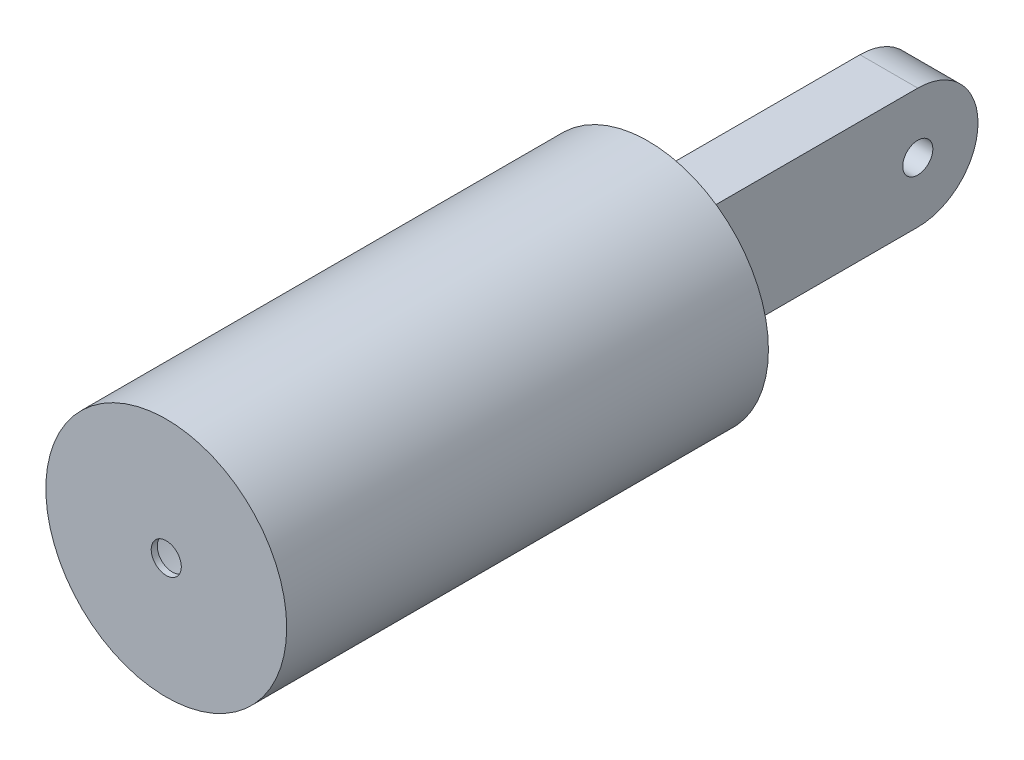
ISO-10303-21;
HEADER;
FILE_DESCRIPTION(('STEP AP214'),'2;1');
FILE_NAME('part.step','',(''),(''),'','','');
FILE_SCHEMA(('AUTOMOTIVE_DESIGN { 1 0 10303 214 1 1 1 1 }'));
ENDSEC;
DATA;
#1=APPLICATION_CONTEXT('core data for automotive mechanical design processes');
#2=APPLICATION_PROTOCOL_DEFINITION('international standard','automotive_design',2000,#1);
#3=PRODUCT_CONTEXT('',#1,'mechanical');
#4=PRODUCT('Part','Part','',(#3));
#5=PRODUCT_RELATED_PRODUCT_CATEGORY('part','',(#4));
#6=PRODUCT_DEFINITION_FORMATION('','',#4);
#7=PRODUCT_DEFINITION_CONTEXT('part definition',#1,'design');
#8=PRODUCT_DEFINITION('design','',#6,#7);
#9=PRODUCT_DEFINITION_SHAPE('','',#8);
#10=(LENGTH_UNIT() NAMED_UNIT(*) SI_UNIT(.MILLI.,.METRE.));
#11=(NAMED_UNIT(*) PLANE_ANGLE_UNIT() SI_UNIT($,.RADIAN.));
#12=(NAMED_UNIT(*) SI_UNIT($,.STERADIAN.) SOLID_ANGLE_UNIT());
#13=UNCERTAINTY_MEASURE_WITH_UNIT(LENGTH_MEASURE(1.E-05),#10,'distance_accuracy_value','');
#14=(GEOMETRIC_REPRESENTATION_CONTEXT(3) GLOBAL_UNCERTAINTY_ASSIGNED_CONTEXT((#13)) GLOBAL_UNIT_ASSIGNED_CONTEXT((#10,
#11,#12)) REPRESENTATION_CONTEXT('',''));
#15=CARTESIAN_POINT('',(0.,0.,0.));
#16=DIRECTION('',(0.,0.,1.));
#17=DIRECTION('',(1.,0.,0.));
#18=AXIS2_PLACEMENT_3D('',#15,#16,#17);
#19=CARTESIAN_POINT('',(0.,0.,-19.5));
#20=DIRECTION('',(0.,0.,1.));
#21=DIRECTION('',(1.,0.,0.));
#22=AXIS2_PLACEMENT_3D('',#19,#20,#21);
#23=CYLINDRICAL_SURFACE('',#22,9.75);
#24=CARTESIAN_POINT('',(0.,0.,-19.5));
#25=DIRECTION('',(0.,0.,1.));
#26=DIRECTION('',(1.,0.,0.));
#27=AXIS2_PLACEMENT_3D('',#24,#25,#26);
#28=CIRCLE('',#27,9.75);
#29=CARTESIAN_POINT('',(9.75,0.,-19.5));
#30=VERTEX_POINT('',#29);
#31=EDGE_CURVE('E116',#30,#30,#28,.T.);
#32=ORIENTED_EDGE('',*,*,#31,.F.);
#33=EDGE_LOOP('',(#32));
#34=FACE_BOUND('',#33,.T.);
#35=CARTESIAN_POINT('',(0.,0.,19.5));
#36=DIRECTION('',(0.,0.,1.));
#37=DIRECTION('',(1.,0.,0.));
#38=AXIS2_PLACEMENT_3D('',#35,#36,#37);
#39=CIRCLE('',#38,9.75);
#40=CARTESIAN_POINT('',(9.75,0.,19.5));
#41=VERTEX_POINT('',#40);
#42=EDGE_CURVE('E119',#41,#41,#39,.T.);
#43=ORIENTED_EDGE('',*,*,#42,.T.);
#44=EDGE_LOOP('',(#43));
#45=FACE_BOUND('',#44,.T.);
#46=ADVANCED_FACE('F36',(#34,#45),#23,.F.);
#47=CARTESIAN_POINT('',(0.,0.,-19.5));
#48=DIRECTION('',(0.,0.,1.));
#49=DIRECTION('',(1.,0.,0.));
#50=AXIS2_PLACEMENT_3D('',#47,#48,#49);
#51=PLANE('',#50);
#52=ORIENTED_EDGE('',*,*,#31,.T.);
#53=EDGE_LOOP('',(#52));
#54=FACE_BOUND('',#53,.T.);
#55=ADVANCED_FACE('F139',(#54),#51,.T.);
#56=CARTESIAN_POINT('',(0.,0.,19.5));
#57=DIRECTION('',(0.,0.,1.));
#58=DIRECTION('',(1.,0.,0.));
#59=AXIS2_PLACEMENT_3D('',#56,#57,#58);
#60=PLANE('',#59);
#61=CARTESIAN_POINT('',(0.,0.,19.5));
#62=DIRECTION('',(0.,0.,1.));
#63=DIRECTION('',(1.,0.,0.));
#64=AXIS2_PLACEMENT_3D('',#61,#62,#63);
#65=CIRCLE('',#64,1.25);
#66=CARTESIAN_POINT('',(1.25,0.,19.5));
#67=VERTEX_POINT('',#66);
#68=EDGE_CURVE('E115',#67,#67,#65,.T.);
#69=ORIENTED_EDGE('',*,*,#68,.T.);
#70=EDGE_LOOP('',(#69));
#71=FACE_BOUND('',#70,.T.);
#72=ORIENTED_EDGE('',*,*,#42,.F.);
#73=EDGE_LOOP('',(#72));
#74=FACE_BOUND('',#73,.T.);
#75=ADVANCED_FACE('F126',(#71,#74),#60,.F.);
#76=CARTESIAN_POINT('',(0.,0.,19.));
#77=DIRECTION('',(0.,0.,1.));
#78=DIRECTION('',(1.,0.,0.));
#79=AXIS2_PLACEMENT_3D('',#76,#77,#78);
#80=CYLINDRICAL_SURFACE('',#79,1.25);
#81=CARTESIAN_POINT('',(0.,0.,20.));
#82=DIRECTION('',(0.,0.,1.));
#83=DIRECTION('',(1.,0.,0.));
#84=AXIS2_PLACEMENT_3D('',#81,#82,#83);
#85=CIRCLE('',#84,1.25);
#86=CARTESIAN_POINT('',(1.25,0.,20.));
#87=VERTEX_POINT('',#86);
#88=EDGE_CURVE('E112',#87,#87,#85,.T.);
#89=ORIENTED_EDGE('',*,*,#88,.T.);
#90=EDGE_LOOP('',(#89));
#91=FACE_BOUND('',#90,.T.);
#92=ORIENTED_EDGE('',*,*,#68,.F.);
#93=EDGE_LOOP('',(#92));
#94=FACE_BOUND('',#93,.T.);
#95=ADVANCED_FACE('F129',(#91,#94),#80,.F.);
#96=CARTESIAN_POINT('',(0.,0.,20.));
#97=DIRECTION('',(0.,0.,-1.));
#98=DIRECTION('',(-1.,0.,0.));
#99=AXIS2_PLACEMENT_3D('',#96,#97,#98);
#100=CYLINDRICAL_SURFACE('',#99,10.);
#101=CARTESIAN_POINT('',(0.,0.,20.));
#102=DIRECTION('',(0.,0.,1.));
#103=DIRECTION('',(1.,0.,0.));
#104=AXIS2_PLACEMENT_3D('',#101,#102,#103);
#105=CIRCLE('',#104,10.);
#106=CARTESIAN_POINT('',(10.,0.,20.));
#107=VERTEX_POINT('',#106);
#108=EDGE_CURVE('E11',#107,#107,#105,.T.);
#109=ORIENTED_EDGE('',*,*,#108,.F.);
#110=EDGE_LOOP('',(#109));
#111=FACE_BOUND('',#110,.T.);
#112=CARTESIAN_POINT('',(0.,0.,-20.));
#113=DIRECTION('',(0.,0.,1.));
#114=DIRECTION('',(1.,0.,0.));
#115=AXIS2_PLACEMENT_3D('',#112,#113,#114);
#116=CIRCLE('',#115,10.);
#117=CARTESIAN_POINT('',(10.,0.,-20.));
#118=VERTEX_POINT('',#117);
#119=EDGE_CURVE('E45',#118,#118,#116,.T.);
#120=ORIENTED_EDGE('',*,*,#119,.T.);
#121=EDGE_LOOP('',(#120));
#122=FACE_BOUND('',#121,.T.);
#123=ADVANCED_FACE('F38',(#111,#122),#100,.T.);
#124=CARTESIAN_POINT('',(0.,0.,20.));
#125=DIRECTION('',(0.,0.,1.));
#126=DIRECTION('',(1.,0.,0.));
#127=AXIS2_PLACEMENT_3D('',#124,#125,#126);
#128=PLANE('',#127);
#129=ORIENTED_EDGE('',*,*,#88,.F.);
#130=EDGE_LOOP('',(#129));
#131=FACE_BOUND('',#130,.T.);
#132=ORIENTED_EDGE('',*,*,#108,.T.);
#133=EDGE_LOOP('',(#132));
#134=FACE_BOUND('',#133,.T.);
#135=ADVANCED_FACE('F137',(#131,#134),#128,.T.);
#136=CARTESIAN_POINT('',(0.,0.,-20.));
#137=DIRECTION('',(0.,0.,1.));
#138=DIRECTION('',(1.,0.,0.));
#139=AXIS2_PLACEMENT_3D('',#136,#137,#138);
#140=PLANE('',#139);
#141=DIRECTION('',(-1.,0.,0.));
#142=VECTOR('',#141,1.);
#143=CARTESIAN_POINT('',(2.4,-5.,-20.));
#144=LINE('',#143,#142);
#145=CARTESIAN_POINT('',(2.4,-5.,-20.));
#146=VERTEX_POINT('',#145);
#147=CARTESIAN_POINT('',(-2.4,-5.,-20.));
#148=VERTEX_POINT('',#147);
#149=EDGE_CURVE('E58',#146,#148,#144,.T.);
#150=ORIENTED_EDGE('',*,*,#149,.F.);
#151=DIRECTION('',(0.,-1.,0.));
#152=VECTOR('',#151,1.);
#153=CARTESIAN_POINT('',(2.4,5.,-20.));
#154=LINE('',#153,#152);
#155=CARTESIAN_POINT('',(2.4,5.,-20.));
#156=VERTEX_POINT('',#155);
#157=EDGE_CURVE('E53',#156,#146,#154,.T.);
#158=ORIENTED_EDGE('',*,*,#157,.F.);
#159=DIRECTION('',(-1.,0.,0.));
#160=VECTOR('',#159,1.);
#161=CARTESIAN_POINT('',(2.4,5.,-20.));
#162=LINE('',#161,#160);
#163=CARTESIAN_POINT('',(-2.4,5.,-20.));
#164=VERTEX_POINT('',#163);
#165=EDGE_CURVE('E110',#156,#164,#162,.T.);
#166=ORIENTED_EDGE('',*,*,#165,.T.);
#167=DIRECTION('',(0.,-1.,0.));
#168=VECTOR('',#167,1.);
#169=CARTESIAN_POINT('',(-2.4,5.,-20.));
#170=LINE('',#169,#168);
#171=EDGE_CURVE('E103',#164,#148,#170,.T.);
#172=ORIENTED_EDGE('',*,*,#171,.T.);
#173=EDGE_LOOP('',(#150,#158,#166,#172));
#174=FACE_BOUND('',#173,.T.);
#175=ORIENTED_EDGE('',*,*,#119,.F.);
#176=EDGE_LOOP('',(#175));
#177=FACE_BOUND('',#176,.T.);
#178=ADVANCED_FACE('F154',(#174,#177),#140,.F.);
#179=CARTESIAN_POINT('',(2.4,5.,-20.));
#180=DIRECTION('',(0.,-1.,0.));
#181=DIRECTION('',(0.,0.,-1.));
#182=AXIS2_PLACEMENT_3D('',#179,#180,#181);
#183=PLANE('',#182);
#184=DIRECTION('',(0.,0.,1.));
#185=VECTOR('',#184,1.);
#186=CARTESIAN_POINT('',(-2.4,5.,-20.));
#187=LINE('',#186,#185);
#188=CARTESIAN_POINT('',(-2.4,5.,-40.));
#189=VERTEX_POINT('',#188);
#190=EDGE_CURVE('E100',#189,#164,#187,.T.);
#191=ORIENTED_EDGE('',*,*,#190,.T.);
#192=ORIENTED_EDGE('',*,*,#165,.F.);
#193=DIRECTION('',(0.,0.,1.));
#194=VECTOR('',#193,1.);
#195=CARTESIAN_POINT('',(2.4,5.,-20.));
#196=LINE('',#195,#194);
#197=CARTESIAN_POINT('',(2.4,5.,-40.));
#198=VERTEX_POINT('',#197);
#199=EDGE_CURVE('E107',#198,#156,#196,.T.);
#200=ORIENTED_EDGE('',*,*,#199,.F.);
#201=DIRECTION('',(-1.,0.,0.));
#202=VECTOR('',#201,1.);
#203=CARTESIAN_POINT('',(2.4,5.,-40.));
#204=LINE('',#203,#202);
#205=EDGE_CURVE('E91',#198,#189,#204,.T.);
#206=ORIENTED_EDGE('',*,*,#205,.T.);
#207=EDGE_LOOP('',(#191,#192,#200,#206));
#208=FACE_BOUND('',#207,.T.);
#209=ADVANCED_FACE('F157',(#208),#183,.F.);
#210=CARTESIAN_POINT('',(2.4,-5.,-40.));
#211=DIRECTION('',(0.,1.,0.));
#212=DIRECTION('',(0.,0.,1.));
#213=AXIS2_PLACEMENT_3D('',#210,#211,#212);
#214=PLANE('',#213);
#215=DIRECTION('',(0.,0.,-1.));
#216=VECTOR('',#215,1.);
#217=CARTESIAN_POINT('',(-2.4,-5.,-40.));
#218=LINE('',#217,#216);
#219=CARTESIAN_POINT('',(-2.4,-5.,-40.));
#220=VERTEX_POINT('',#219);
#221=EDGE_CURVE('E88',#148,#220,#218,.T.);
#222=ORIENTED_EDGE('',*,*,#221,.T.);
#223=DIRECTION('',(-1.,0.,0.));
#224=VECTOR('',#223,1.);
#225=CARTESIAN_POINT('',(2.4,-5.,-40.));
#226=LINE('',#225,#224);
#227=CARTESIAN_POINT('',(2.4,-5.,-40.));
#228=VERTEX_POINT('',#227);
#229=EDGE_CURVE('E85',#228,#220,#226,.T.);
#230=ORIENTED_EDGE('',*,*,#229,.F.);
#231=DIRECTION('',(0.,0.,-1.));
#232=VECTOR('',#231,1.);
#233=CARTESIAN_POINT('',(2.4,-5.,-40.));
#234=LINE('',#233,#232);
#235=EDGE_CURVE('E76',#146,#228,#234,.T.);
#236=ORIENTED_EDGE('',*,*,#235,.F.);
#237=ORIENTED_EDGE('',*,*,#149,.T.);
#238=EDGE_LOOP('',(#222,#230,#236,#237));
#239=FACE_BOUND('',#238,.T.);
#240=ADVANCED_FACE('F86',(#239),#214,.F.);
#241=CARTESIAN_POINT('',(2.4,0.,-40.));
#242=DIRECTION('',(-1.,0.,0.));
#243=DIRECTION('',(0.,0.,1.));
#244=AXIS2_PLACEMENT_3D('',#241,#242,#243);
#245=CYLINDRICAL_SURFACE('',#244,5.);
#246=CARTESIAN_POINT('',(-2.4,0.,-40.));
#247=DIRECTION('',(1.,0.,0.));
#248=DIRECTION('',(0.,0.,-1.));
#249=AXIS2_PLACEMENT_3D('',#246,#247,#248);
#250=CIRCLE('',#249,5.);
#251=EDGE_CURVE('E106',#220,#189,#250,.T.);
#252=ORIENTED_EDGE('',*,*,#251,.T.);
#253=ORIENTED_EDGE('',*,*,#205,.F.);
#254=CARTESIAN_POINT('',(2.4,0.,-40.));
#255=DIRECTION('',(1.,0.,0.));
#256=DIRECTION('',(0.,0.,-1.));
#257=AXIS2_PLACEMENT_3D('',#254,#255,#256);
#258=CIRCLE('',#257,5.);
#259=EDGE_CURVE('E80',#228,#198,#258,.T.);
#260=ORIENTED_EDGE('',*,*,#259,.F.);
#261=ORIENTED_EDGE('',*,*,#229,.T.);
#262=EDGE_LOOP('',(#252,#253,#260,#261));
#263=FACE_BOUND('',#262,.T.);
#264=ADVANCED_FACE('F93',(#263),#245,.T.);
#265=CARTESIAN_POINT('',(2.4,0.,-40.));
#266=DIRECTION('',(1.,0.,0.));
#267=DIRECTION('',(0.,0.,-1.));
#268=AXIS2_PLACEMENT_3D('',#265,#266,#267);
#269=PLANE('',#268);
#270=CARTESIAN_POINT('',(2.4,0.,-40.));
#271=DIRECTION('',(1.,0.,0.));
#272=DIRECTION('',(0.,0.,-1.));
#273=AXIS2_PLACEMENT_3D('',#270,#271,#272);
#274=CIRCLE('',#273,1.25000000000001);
#275=CARTESIAN_POINT('',(2.4,0.,-41.25));
#276=VERTEX_POINT('',#275);
#277=EDGE_CURVE('E187',#276,#276,#274,.T.);
#278=ORIENTED_EDGE('',*,*,#277,.F.);
#279=EDGE_LOOP('',(#278));
#280=FACE_BOUND('',#279,.T.);
#281=ORIENTED_EDGE('',*,*,#199,.T.);
#282=ORIENTED_EDGE('',*,*,#157,.T.);
#283=ORIENTED_EDGE('',*,*,#235,.T.);
#284=ORIENTED_EDGE('',*,*,#259,.T.);
#285=EDGE_LOOP('',(#281,#282,#283,#284));
#286=FACE_BOUND('',#285,.T.);
#287=ADVANCED_FACE('F78',(#280,#286),#269,.T.);
#288=CARTESIAN_POINT('',(-2.4,0.,-40.));
#289=DIRECTION('',(1.,0.,0.));
#290=DIRECTION('',(0.,0.,-1.));
#291=AXIS2_PLACEMENT_3D('',#288,#289,#290);
#292=PLANE('',#291);
#293=CARTESIAN_POINT('',(-2.4,0.,-40.));
#294=DIRECTION('',(1.,0.,0.));
#295=DIRECTION('',(0.,0.,-1.));
#296=AXIS2_PLACEMENT_3D('',#293,#294,#295);
#297=CIRCLE('',#296,1.25000000000001);
#298=CARTESIAN_POINT('',(-2.4,0.,-41.25));
#299=VERTEX_POINT('',#298);
#300=EDGE_CURVE('E40',#299,#299,#297,.T.);
#301=ORIENTED_EDGE('',*,*,#300,.T.);
#302=EDGE_LOOP('',(#301));
#303=FACE_BOUND('',#302,.T.);
#304=ORIENTED_EDGE('',*,*,#190,.F.);
#305=ORIENTED_EDGE('',*,*,#251,.F.);
#306=ORIENTED_EDGE('',*,*,#221,.F.);
#307=ORIENTED_EDGE('',*,*,#171,.F.);
#308=EDGE_LOOP('',(#304,#305,#306,#307));
#309=FACE_BOUND('',#308,.T.);
#310=ADVANCED_FACE('F172',(#303,#309),#292,.F.);
#311=CARTESIAN_POINT('',(-7.6,0.,-40.));
#312=DIRECTION('',(1.,0.,0.));
#313=DIRECTION('',(0.,0.,-1.));
#314=AXIS2_PLACEMENT_3D('',#311,#312,#313);
#315=CYLINDRICAL_SURFACE('',#314,1.25000000000001);
#316=ORIENTED_EDGE('',*,*,#277,.T.);
#317=EDGE_LOOP('',(#316));
#318=FACE_BOUND('',#317,.T.);
#319=ORIENTED_EDGE('',*,*,#300,.F.);
#320=EDGE_LOOP('',(#319));
#321=FACE_BOUND('',#320,.T.);
#322=ADVANCED_FACE('F175',(#318,#321),#315,.F.);
#323=CLOSED_SHELL('',(#46,#55,#75,#95,#123,#135,#178,#209,#240,#264,#287,#310,#322));
#324=MANIFOLD_SOLID_BREP('B2',#323);
#325=ADVANCED_BREP_SHAPE_REPRESENTATION('',(#18,#324),#14);
#326=SHAPE_DEFINITION_REPRESENTATION(#9,#325);
ENDSEC;
END-ISO-10303-21;
